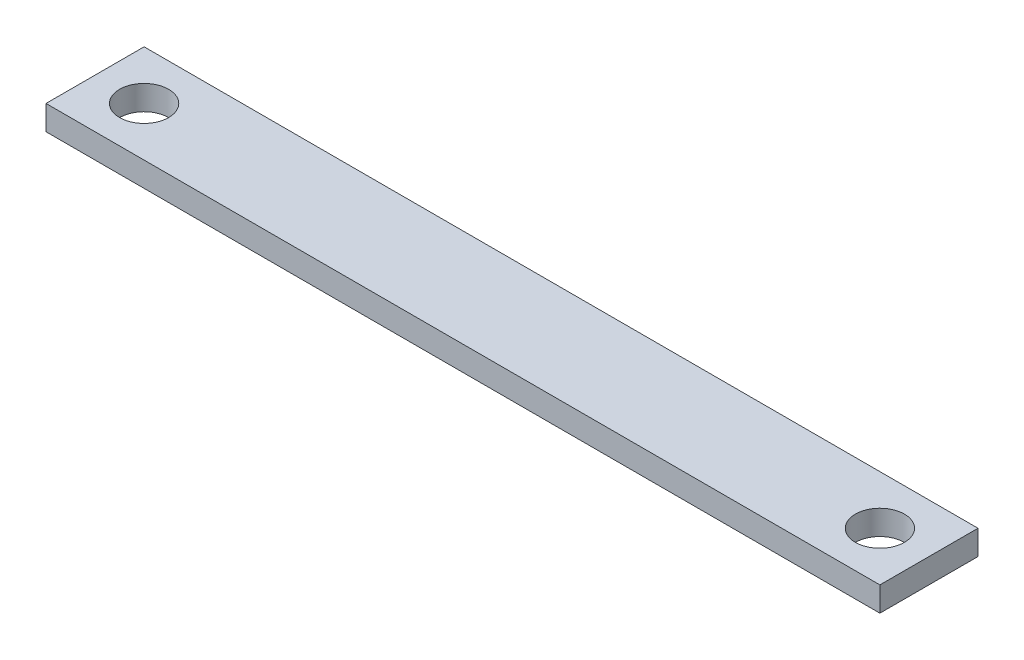
ISO-10303-21;
HEADER;
FILE_DESCRIPTION(('STEP AP214'),'2;1');
FILE_NAME('part.step','',(''),(''),'','','');
FILE_SCHEMA(('AUTOMOTIVE_DESIGN { 1 0 10303 214 1 1 1 1 }'));
ENDSEC;
DATA;
#1=APPLICATION_CONTEXT('core data for automotive mechanical design processes');
#2=APPLICATION_PROTOCOL_DEFINITION('international standard','automotive_design',2000,#1);
#3=PRODUCT_CONTEXT('',#1,'mechanical');
#4=PRODUCT('Part','Part','',(#3));
#5=PRODUCT_RELATED_PRODUCT_CATEGORY('part','',(#4));
#6=PRODUCT_DEFINITION_FORMATION('','',#4);
#7=PRODUCT_DEFINITION_CONTEXT('part definition',#1,'design');
#8=PRODUCT_DEFINITION('design','',#6,#7);
#9=PRODUCT_DEFINITION_SHAPE('','',#8);
#10=(LENGTH_UNIT() NAMED_UNIT(*) SI_UNIT(.MILLI.,.METRE.));
#11=(NAMED_UNIT(*) PLANE_ANGLE_UNIT() SI_UNIT($,.RADIAN.));
#12=(NAMED_UNIT(*) SI_UNIT($,.STERADIAN.) SOLID_ANGLE_UNIT());
#13=UNCERTAINTY_MEASURE_WITH_UNIT(LENGTH_MEASURE(1.E-05),#10,'distance_accuracy_value','');
#14=(GEOMETRIC_REPRESENTATION_CONTEXT(3) GLOBAL_UNCERTAINTY_ASSIGNED_CONTEXT((#13)) GLOBAL_UNIT_ASSIGNED_CONTEXT((#10,
#11,#12)) REPRESENTATION_CONTEXT('',''));
#15=CARTESIAN_POINT('',(0.,0.,0.));
#16=DIRECTION('',(0.,0.,1.));
#17=DIRECTION('',(1.,0.,0.));
#18=AXIS2_PLACEMENT_3D('',#15,#16,#17);
#19=CARTESIAN_POINT('',(0.,6.35,0.));
#20=DIRECTION('',(0.,-1.,0.));
#21=DIRECTION('',(0.,0.,-1.));
#22=AXIS2_PLACEMENT_3D('',#19,#20,#21);
#23=PLANE('',#22);
#24=DIRECTION('',(0.,0.,-1.));
#25=VECTOR('',#24,1.);
#26=CARTESIAN_POINT('',(107.95,6.35,12.7));
#27=LINE('',#26,#25);
#28=CARTESIAN_POINT('',(107.95,6.35,12.7));
#29=VERTEX_POINT('',#28);
#30=CARTESIAN_POINT('',(107.95,6.35,-12.7));
#31=VERTEX_POINT('',#30);
#32=EDGE_CURVE('E85',#29,#31,#27,.T.);
#33=ORIENTED_EDGE('',*,*,#32,.T.);
#34=DIRECTION('',(-1.,0.,0.));
#35=VECTOR('',#34,1.);
#36=CARTESIAN_POINT('',(-107.95,6.35,-12.7));
#37=LINE('',#36,#35);
#38=CARTESIAN_POINT('',(-107.95,6.35,-12.7));
#39=VERTEX_POINT('',#38);
#40=EDGE_CURVE('E80',#31,#39,#37,.T.);
#41=ORIENTED_EDGE('',*,*,#40,.T.);
#42=DIRECTION('',(0.,0.,1.));
#43=VECTOR('',#42,1.);
#44=CARTESIAN_POINT('',(-107.95,6.35,12.7));
#45=LINE('',#44,#43);
#46=CARTESIAN_POINT('',(-107.95,6.35,12.7));
#47=VERTEX_POINT('',#46);
#48=EDGE_CURVE('E83',#39,#47,#45,.T.);
#49=ORIENTED_EDGE('',*,*,#48,.T.);
#50=DIRECTION('',(1.,0.,0.));
#51=VECTOR('',#50,1.);
#52=CARTESIAN_POINT('',(-107.95,6.35,12.7));
#53=LINE('',#52,#51);
#54=EDGE_CURVE('E50',#47,#29,#53,.T.);
#55=ORIENTED_EDGE('',*,*,#54,.T.);
#56=EDGE_LOOP('',(#33,#41,#49,#55));
#57=FACE_BOUND('',#56,.T.);
#58=CARTESIAN_POINT('',(-95.25,6.35,0.));
#59=DIRECTION('',(0.,1.,0.));
#60=DIRECTION('',(0.,0.,1.));
#61=AXIS2_PLACEMENT_3D('',#58,#59,#60);
#62=CIRCLE('',#61,6.35);
#63=CARTESIAN_POINT('',(-95.25,6.35,6.35));
#64=VERTEX_POINT('',#63);
#65=EDGE_CURVE('E100',#64,#64,#62,.T.);
#66=ORIENTED_EDGE('',*,*,#65,.F.);
#67=EDGE_LOOP('',(#66));
#68=FACE_BOUND('',#67,.T.);
#69=CARTESIAN_POINT('',(95.25,6.35,0.));
#70=DIRECTION('',(0.,1.,0.));
#71=DIRECTION('',(0.,0.,1.));
#72=AXIS2_PLACEMENT_3D('',#69,#70,#71);
#73=CIRCLE('',#72,6.35);
#74=CARTESIAN_POINT('',(95.25,6.35,6.35));
#75=VERTEX_POINT('',#74);
#76=EDGE_CURVE('E115',#75,#75,#73,.T.);
#77=ORIENTED_EDGE('',*,*,#76,.F.);
#78=EDGE_LOOP('',(#77));
#79=FACE_BOUND('',#78,.T.);
#80=ADVANCED_FACE('F33',(#57,#68,#79),#23,.F.);
#81=CARTESIAN_POINT('',(0.,0.,0.));
#82=DIRECTION('',(0.,-1.,0.));
#83=DIRECTION('',(0.,0.,-1.));
#84=AXIS2_PLACEMENT_3D('',#81,#82,#83);
#85=PLANE('',#84);
#86=CARTESIAN_POINT('',(-95.25,0.,0.));
#87=DIRECTION('',(0.,1.,0.));
#88=DIRECTION('',(0.,0.,1.));
#89=AXIS2_PLACEMENT_3D('',#86,#87,#88);
#90=CIRCLE('',#89,6.35);
#91=CARTESIAN_POINT('',(-95.25,0.,6.35));
#92=VERTEX_POINT('',#91);
#93=EDGE_CURVE('E112',#92,#92,#90,.T.);
#94=ORIENTED_EDGE('',*,*,#93,.T.);
#95=EDGE_LOOP('',(#94));
#96=FACE_BOUND('',#95,.T.);
#97=DIRECTION('',(0.,0.,-1.));
#98=VECTOR('',#97,1.);
#99=CARTESIAN_POINT('',(107.95,0.,12.7));
#100=LINE('',#99,#98);
#101=CARTESIAN_POINT('',(107.95,0.,12.7));
#102=VERTEX_POINT('',#101);
#103=CARTESIAN_POINT('',(107.95,0.,-12.7));
#104=VERTEX_POINT('',#103);
#105=EDGE_CURVE('E97',#102,#104,#100,.T.);
#106=ORIENTED_EDGE('',*,*,#105,.F.);
#107=DIRECTION('',(1.,0.,0.));
#108=VECTOR('',#107,1.);
#109=CARTESIAN_POINT('',(-107.95,0.,12.7));
#110=LINE('',#109,#108);
#111=CARTESIAN_POINT('',(-107.95,0.,12.7));
#112=VERTEX_POINT('',#111);
#113=EDGE_CURVE('E73',#112,#102,#110,.T.);
#114=ORIENTED_EDGE('',*,*,#113,.F.);
#115=DIRECTION('',(0.,0.,1.));
#116=VECTOR('',#115,1.);
#117=CARTESIAN_POINT('',(-107.95,0.,12.7));
#118=LINE('',#117,#116);
#119=CARTESIAN_POINT('',(-107.95,0.,-12.7));
#120=VERTEX_POINT('',#119);
#121=EDGE_CURVE('E67',#120,#112,#118,.T.);
#122=ORIENTED_EDGE('',*,*,#121,.F.);
#123=DIRECTION('',(-1.,0.,0.));
#124=VECTOR('',#123,1.);
#125=CARTESIAN_POINT('',(-107.95,0.,-12.7));
#126=LINE('',#125,#124);
#127=EDGE_CURVE('E89',#104,#120,#126,.T.);
#128=ORIENTED_EDGE('',*,*,#127,.F.);
#129=EDGE_LOOP('',(#106,#114,#122,#128));
#130=FACE_BOUND('',#129,.T.);
#131=CARTESIAN_POINT('',(95.25,0.,0.));
#132=DIRECTION('',(0.,1.,0.));
#133=DIRECTION('',(0.,0.,1.));
#134=AXIS2_PLACEMENT_3D('',#131,#132,#133);
#135=CIRCLE('',#134,6.35);
#136=CARTESIAN_POINT('',(95.25,0.,6.35));
#137=VERTEX_POINT('',#136);
#138=EDGE_CURVE('E118',#137,#137,#135,.T.);
#139=ORIENTED_EDGE('',*,*,#138,.T.);
#140=EDGE_LOOP('',(#139));
#141=FACE_BOUND('',#140,.T.);
#142=ADVANCED_FACE('F108',(#96,#130,#141),#85,.T.);
#143=CARTESIAN_POINT('',(107.95,6.35,12.7));
#144=DIRECTION('',(-1.,0.,0.));
#145=DIRECTION('',(0.,0.,1.));
#146=AXIS2_PLACEMENT_3D('',#143,#144,#145);
#147=PLANE('',#146);
#148=ORIENTED_EDGE('',*,*,#105,.T.);
#149=DIRECTION('',(0.,-1.,0.));
#150=VECTOR('',#149,1.);
#151=CARTESIAN_POINT('',(107.95,6.35,-12.7));
#152=LINE('',#151,#150);
#153=EDGE_CURVE('E11',#31,#104,#152,.T.);
#154=ORIENTED_EDGE('',*,*,#153,.F.);
#155=ORIENTED_EDGE('',*,*,#32,.F.);
#156=DIRECTION('',(0.,-1.,0.));
#157=VECTOR('',#156,1.);
#158=CARTESIAN_POINT('',(107.95,6.35,12.7));
#159=LINE('',#158,#157);
#160=EDGE_CURVE('E93',#29,#102,#159,.T.);
#161=ORIENTED_EDGE('',*,*,#160,.T.);
#162=EDGE_LOOP('',(#148,#154,#155,#161));
#163=FACE_BOUND('',#162,.T.);
#164=ADVANCED_FACE('F35',(#163),#147,.F.);
#165=CARTESIAN_POINT('',(-107.95,6.35,-12.7));
#166=DIRECTION('',(0.,0.,1.));
#167=DIRECTION('',(1.,0.,0.));
#168=AXIS2_PLACEMENT_3D('',#165,#166,#167);
#169=PLANE('',#168);
#170=ORIENTED_EDGE('',*,*,#127,.T.);
#171=DIRECTION('',(0.,-1.,0.));
#172=VECTOR('',#171,1.);
#173=CARTESIAN_POINT('',(-107.95,6.35,-12.7));
#174=LINE('',#173,#172);
#175=EDGE_CURVE('E42',#39,#120,#174,.T.);
#176=ORIENTED_EDGE('',*,*,#175,.F.);
#177=ORIENTED_EDGE('',*,*,#40,.F.);
#178=ORIENTED_EDGE('',*,*,#153,.T.);
#179=EDGE_LOOP('',(#170,#176,#177,#178));
#180=FACE_BOUND('',#179,.T.);
#181=ADVANCED_FACE('F88',(#180),#169,.F.);
#182=CARTESIAN_POINT('',(-107.95,6.35,12.7));
#183=DIRECTION('',(1.,0.,0.));
#184=DIRECTION('',(0.,0.,-1.));
#185=AXIS2_PLACEMENT_3D('',#182,#183,#184);
#186=PLANE('',#185);
#187=ORIENTED_EDGE('',*,*,#121,.T.);
#188=DIRECTION('',(0.,-1.,0.));
#189=VECTOR('',#188,1.);
#190=CARTESIAN_POINT('',(-107.95,6.35,12.7));
#191=LINE('',#190,#189);
#192=EDGE_CURVE('E90',#47,#112,#191,.T.);
#193=ORIENTED_EDGE('',*,*,#192,.F.);
#194=ORIENTED_EDGE('',*,*,#48,.F.);
#195=ORIENTED_EDGE('',*,*,#175,.T.);
#196=EDGE_LOOP('',(#187,#193,#194,#195));
#197=FACE_BOUND('',#196,.T.);
#198=ADVANCED_FACE('F91',(#197),#186,.F.);
#199=CARTESIAN_POINT('',(-107.95,6.35,12.7));
#200=DIRECTION('',(0.,0.,-1.));
#201=DIRECTION('',(-1.,0.,0.));
#202=AXIS2_PLACEMENT_3D('',#199,#200,#201);
#203=PLANE('',#202);
#204=ORIENTED_EDGE('',*,*,#113,.T.);
#205=ORIENTED_EDGE('',*,*,#160,.F.);
#206=ORIENTED_EDGE('',*,*,#54,.F.);
#207=ORIENTED_EDGE('',*,*,#192,.T.);
#208=EDGE_LOOP('',(#204,#205,#206,#207));
#209=FACE_BOUND('',#208,.T.);
#210=ADVANCED_FACE('F105',(#209),#203,.F.);
#211=CARTESIAN_POINT('',(-95.25,6.35,0.));
#212=DIRECTION('',(0.,-1.,0.));
#213=DIRECTION('',(0.,0.,-1.));
#214=AXIS2_PLACEMENT_3D('',#211,#212,#213);
#215=CYLINDRICAL_SURFACE('',#214,6.35);
#216=ORIENTED_EDGE('',*,*,#65,.T.);
#217=EDGE_LOOP('',(#216));
#218=FACE_BOUND('',#217,.T.);
#219=ORIENTED_EDGE('',*,*,#93,.F.);
#220=EDGE_LOOP('',(#219));
#221=FACE_BOUND('',#220,.T.);
#222=ADVANCED_FACE('F135',(#218,#221),#215,.F.);
#223=CARTESIAN_POINT('',(95.25,6.35,0.));
#224=DIRECTION('',(0.,-1.,0.));
#225=DIRECTION('',(0.,0.,-1.));
#226=AXIS2_PLACEMENT_3D('',#223,#224,#225);
#227=CYLINDRICAL_SURFACE('',#226,6.35);
#228=ORIENTED_EDGE('',*,*,#76,.T.);
#229=EDGE_LOOP('',(#228));
#230=FACE_BOUND('',#229,.T.);
#231=ORIENTED_EDGE('',*,*,#138,.F.);
#232=EDGE_LOOP('',(#231));
#233=FACE_BOUND('',#232,.T.);
#234=ADVANCED_FACE('F124',(#230,#233),#227,.F.);
#235=CLOSED_SHELL('',(#80,#142,#164,#181,#198,#210,#222,#234));
#236=MANIFOLD_SOLID_BREP('B2',#235);
#237=ADVANCED_BREP_SHAPE_REPRESENTATION('',(#18,#236),#14);
#238=SHAPE_DEFINITION_REPRESENTATION(#9,#237);
ENDSEC;
END-ISO-10303-21;
